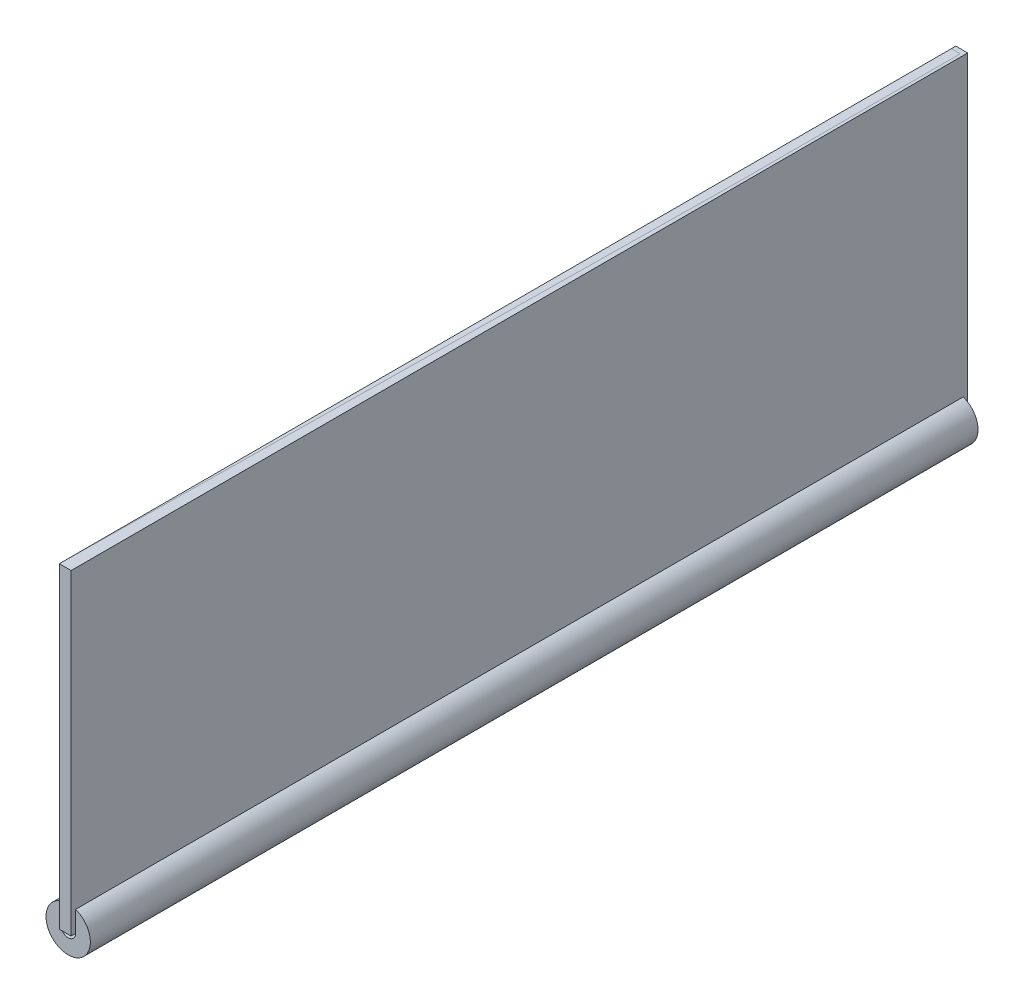
ISO-10303-21;
HEADER;
FILE_DESCRIPTION(('STEP AP214'),'2;1');
FILE_NAME('part.step','',(''),(''),'','','');
FILE_SCHEMA(('AUTOMOTIVE_DESIGN { 1 0 10303 214 1 1 1 1 }'));
ENDSEC;
DATA;
#1=APPLICATION_CONTEXT('core data for automotive mechanical design processes');
#2=APPLICATION_PROTOCOL_DEFINITION('international standard','automotive_design',2000,#1);
#3=PRODUCT_CONTEXT('',#1,'mechanical');
#4=PRODUCT('Part','Part','',(#3));
#5=PRODUCT_RELATED_PRODUCT_CATEGORY('part','',(#4));
#6=PRODUCT_DEFINITION_FORMATION('','',#4);
#7=PRODUCT_DEFINITION_CONTEXT('part definition',#1,'design');
#8=PRODUCT_DEFINITION('design','',#6,#7);
#9=PRODUCT_DEFINITION_SHAPE('','',#8);
#10=(LENGTH_UNIT() NAMED_UNIT(*) SI_UNIT(.MILLI.,.METRE.));
#11=(NAMED_UNIT(*) PLANE_ANGLE_UNIT() SI_UNIT($,.RADIAN.));
#12=(NAMED_UNIT(*) SI_UNIT($,.STERADIAN.) SOLID_ANGLE_UNIT());
#13=UNCERTAINTY_MEASURE_WITH_UNIT(LENGTH_MEASURE(1.E-05),#10,'distance_accuracy_value','');
#14=(GEOMETRIC_REPRESENTATION_CONTEXT(3) GLOBAL_UNCERTAINTY_ASSIGNED_CONTEXT((#13)) GLOBAL_UNIT_ASSIGNED_CONTEXT((#10,
#11,#12)) REPRESENTATION_CONTEXT('',''));
#15=CARTESIAN_POINT('',(0.,0.,0.));
#16=DIRECTION('',(0.,0.,1.));
#17=DIRECTION('',(1.,0.,0.));
#18=AXIS2_PLACEMENT_3D('',#15,#16,#17);
#19=CARTESIAN_POINT('',(4.,53.5,-151.5));
#20=DIRECTION('',(0.,0.,1.));
#21=DIRECTION('',(1.,0.,0.));
#22=AXIS2_PLACEMENT_3D('',#19,#20,#21);
#23=PLANE('',#22);
#24=DIRECTION('',(0.,1.,0.));
#25=VECTOR('',#24,1.);
#26=CARTESIAN_POINT('',(0.,53.5,-151.5));
#27=LINE('',#26,#25);
#28=CARTESIAN_POINT('',(0.,-53.5,-151.5));
#29=VERTEX_POINT('',#28);
#30=CARTESIAN_POINT('',(0.,53.5,-151.5));
#31=VERTEX_POINT('',#30);
#32=EDGE_CURVE('E110',#29,#31,#27,.T.);
#33=ORIENTED_EDGE('',*,*,#32,.T.);
#34=DIRECTION('',(-1.,0.,0.));
#35=VECTOR('',#34,1.);
#36=CARTESIAN_POINT('',(4.,53.5,-151.5));
#37=LINE('',#36,#35);
#38=CARTESIAN_POINT('',(4.,53.5,-151.5));
#39=VERTEX_POINT('',#38);
#40=EDGE_CURVE('E12',#39,#31,#37,.T.);
#41=ORIENTED_EDGE('',*,*,#40,.F.);
#42=DIRECTION('',(0.,1.,0.));
#43=VECTOR('',#42,1.);
#44=CARTESIAN_POINT('',(4.,53.5,-151.5));
#45=LINE('',#44,#43);
#46=CARTESIAN_POINT('',(4.,-53.5,-151.5));
#47=VERTEX_POINT('',#46);
#48=EDGE_CURVE('E98',#47,#39,#45,.T.);
#49=ORIENTED_EDGE('',*,*,#48,.F.);
#50=DIRECTION('',(-1.,0.,0.));
#51=VECTOR('',#50,1.);
#52=CARTESIAN_POINT('',(4.,-53.5,-151.5));
#53=LINE('',#52,#51);
#54=EDGE_CURVE('E106',#47,#29,#53,.T.);
#55=ORIENTED_EDGE('',*,*,#54,.T.);
#56=EDGE_LOOP('',(#33,#41,#49,#55));
#57=FACE_BOUND('',#56,.T.);
#58=ADVANCED_FACE('F47',(#57),#23,.F.);
#59=CARTESIAN_POINT('',(4.,53.5,151.5));
#60=DIRECTION('',(0.,-1.,0.));
#61=DIRECTION('',(0.,0.,-1.));
#62=AXIS2_PLACEMENT_3D('',#59,#60,#61);
#63=PLANE('',#62);
#64=DIRECTION('',(0.,0.,1.));
#65=VECTOR('',#64,1.);
#66=CARTESIAN_POINT('',(0.,53.5,151.5));
#67=LINE('',#66,#65);
#68=CARTESIAN_POINT('',(0.,53.5,151.5));
#69=VERTEX_POINT('',#68);
#70=EDGE_CURVE('E102',#31,#69,#67,.T.);
#71=ORIENTED_EDGE('',*,*,#70,.T.);
#72=DIRECTION('',(-1.,0.,0.));
#73=VECTOR('',#72,1.);
#74=CARTESIAN_POINT('',(4.,53.5,151.5));
#75=LINE('',#74,#73);
#76=CARTESIAN_POINT('',(4.,53.5,151.5));
#77=VERTEX_POINT('',#76);
#78=EDGE_CURVE('E55',#77,#69,#75,.T.);
#79=ORIENTED_EDGE('',*,*,#78,.F.);
#80=DIRECTION('',(0.,0.,1.));
#81=VECTOR('',#80,1.);
#82=CARTESIAN_POINT('',(4.,53.5,151.5));
#83=LINE('',#82,#81);
#84=EDGE_CURVE('E93',#39,#77,#83,.T.);
#85=ORIENTED_EDGE('',*,*,#84,.F.);
#86=ORIENTED_EDGE('',*,*,#40,.T.);
#87=EDGE_LOOP('',(#71,#79,#85,#86));
#88=FACE_BOUND('',#87,.T.);
#89=ADVANCED_FACE('F101',(#88),#63,.F.);
#90=CARTESIAN_POINT('',(4.,53.5,151.5));
#91=DIRECTION('',(0.,0.,-1.));
#92=DIRECTION('',(-1.,0.,0.));
#93=AXIS2_PLACEMENT_3D('',#90,#91,#92);
#94=PLANE('',#93);
#95=DIRECTION('',(0.,-1.,0.));
#96=VECTOR('',#95,1.);
#97=CARTESIAN_POINT('',(0.,53.5,151.5));
#98=LINE('',#97,#96);
#99=CARTESIAN_POINT('',(0.,-53.5,151.5));
#100=VERTEX_POINT('',#99);
#101=EDGE_CURVE('E80',#69,#100,#98,.T.);
#102=ORIENTED_EDGE('',*,*,#101,.T.);
#103=DIRECTION('',(-1.,0.,0.));
#104=VECTOR('',#103,1.);
#105=CARTESIAN_POINT('',(4.,-53.5,151.5));
#106=LINE('',#105,#104);
#107=CARTESIAN_POINT('',(4.,-53.5,151.5));
#108=VERTEX_POINT('',#107);
#109=EDGE_CURVE('E103',#108,#100,#106,.T.);
#110=ORIENTED_EDGE('',*,*,#109,.F.);
#111=DIRECTION('',(0.,-1.,0.));
#112=VECTOR('',#111,1.);
#113=CARTESIAN_POINT('',(4.,53.5,151.5));
#114=LINE('',#113,#112);
#115=EDGE_CURVE('E96',#77,#108,#114,.T.);
#116=ORIENTED_EDGE('',*,*,#115,.F.);
#117=ORIENTED_EDGE('',*,*,#78,.T.);
#118=EDGE_LOOP('',(#102,#110,#116,#117));
#119=FACE_BOUND('',#118,.T.);
#120=ADVANCED_FACE('F104',(#119),#94,.F.);
#121=CARTESIAN_POINT('',(4.,-53.5,151.5));
#122=DIRECTION('',(0.,1.,0.));
#123=DIRECTION('',(0.,0.,1.));
#124=AXIS2_PLACEMENT_3D('',#121,#122,#123);
#125=PLANE('',#124);
#126=DIRECTION('',(0.,0.,-1.));
#127=VECTOR('',#126,1.);
#128=CARTESIAN_POINT('',(0.,-53.5,151.5));
#129=LINE('',#128,#127);
#130=EDGE_CURVE('E86',#100,#29,#129,.T.);
#131=ORIENTED_EDGE('',*,*,#130,.T.);
#132=ORIENTED_EDGE('',*,*,#54,.F.);
#133=DIRECTION('',(0.,0.,-1.));
#134=VECTOR('',#133,1.);
#135=CARTESIAN_POINT('',(4.,-53.5,151.5));
#136=LINE('',#135,#134);
#137=EDGE_CURVE('E63',#108,#47,#136,.T.);
#138=ORIENTED_EDGE('',*,*,#137,.F.);
#139=ORIENTED_EDGE('',*,*,#109,.T.);
#140=EDGE_LOOP('',(#131,#132,#138,#139));
#141=FACE_BOUND('',#140,.T.);
#142=ADVANCED_FACE('F117',(#141),#125,.F.);
#143=CARTESIAN_POINT('',(4.,0.,0.));
#144=DIRECTION('',(1.,0.,0.));
#145=DIRECTION('',(0.,0.,-1.));
#146=AXIS2_PLACEMENT_3D('',#143,#144,#145);
#147=PLANE('',#146);
#148=ORIENTED_EDGE('',*,*,#48,.T.);
#149=ORIENTED_EDGE('',*,*,#84,.T.);
#150=ORIENTED_EDGE('',*,*,#115,.T.);
#151=ORIENTED_EDGE('',*,*,#137,.T.);
#152=EDGE_LOOP('',(#148,#149,#150,#151));
#153=FACE_BOUND('',#152,.T.);
#154=ADVANCED_FACE('F94',(#153),#147,.T.);
#155=CARTESIAN_POINT('',(0.,0.,0.));
#156=DIRECTION('',(1.,0.,0.));
#157=DIRECTION('',(0.,0.,-1.));
#158=AXIS2_PLACEMENT_3D('',#155,#156,#157);
#159=PLANE('',#158);
#160=ORIENTED_EDGE('',*,*,#32,.F.);
#161=ORIENTED_EDGE('',*,*,#130,.F.);
#162=ORIENTED_EDGE('',*,*,#101,.F.);
#163=ORIENTED_EDGE('',*,*,#70,.F.);
#164=EDGE_LOOP('',(#160,#161,#162,#163));
#165=FACE_BOUND('',#164,.T.);
#166=ADVANCED_FACE('F120',(#165),#159,.F.);
#167=CLOSED_SHELL('',(#58,#89,#120,#142,#154,#166));
#168=MANIFOLD_SOLID_BREP('B2',#167);
#169=CARTESIAN_POINT('',(3.,-53.5,150.));
#170=DIRECTION('',(0.,0.,-1.));
#171=DIRECTION('',(-1.,0.,0.));
#172=AXIS2_PLACEMENT_3D('',#169,#170,#171);
#173=PLANE('',#172);
#174=CARTESIAN_POINT('',(1.5,-53.5,150.));
#175=DIRECTION('',(0.,0.,1.));
#176=DIRECTION('',(1.,0.,0.));
#177=AXIS2_PLACEMENT_3D('',#174,#175,#176);
#178=CIRCLE('',#177,2.5);
#179=CARTESIAN_POINT('',(4.,-53.5,150.));
#180=VERTEX_POINT('',#179);
#181=EDGE_CURVE('E264',#180,#180,#178,.T.);
#182=ORIENTED_EDGE('',*,*,#181,.F.);
#183=EDGE_LOOP('',(#182));
#184=FACE_BOUND('',#183,.T.);
#185=DIRECTION('',(0.,-1.,0.));
#186=VECTOR('',#185,1.);
#187=CARTESIAN_POINT('',(0.,-53.5,150.));
#188=LINE('',#187,#186);
#189=CARTESIAN_POINT('',(0.,53.5,150.));
#190=VERTEX_POINT('',#189);
#191=CARTESIAN_POINT('',(0.,-46.1515307716505,150.));
#192=VERTEX_POINT('',#191);
#193=EDGE_CURVE('E219',#190,#192,#188,.T.);
#194=ORIENTED_EDGE('',*,*,#193,.T.);
#195=CARTESIAN_POINT('',(1.5,-53.5,150.));
#196=DIRECTION('',(0.,0.,1.));
#197=DIRECTION('',(1.,0.,0.));
#198=AXIS2_PLACEMENT_3D('',#195,#196,#197);
#199=CIRCLE('',#198,7.5);
#200=CARTESIAN_POINT('',(3.,-46.1515307716505,150.));
#201=VERTEX_POINT('',#200);
#202=EDGE_CURVE('E216',#192,#201,#199,.T.);
#203=ORIENTED_EDGE('',*,*,#202,.T.);
#204=DIRECTION('',(0.,-1.,0.));
#205=VECTOR('',#204,1.);
#206=CARTESIAN_POINT('',(3.,-53.5,150.));
#207=LINE('',#206,#205);
#208=CARTESIAN_POINT('',(3.,53.5,150.));
#209=VERTEX_POINT('',#208);
#210=EDGE_CURVE('E225',#209,#201,#207,.T.);
#211=ORIENTED_EDGE('',*,*,#210,.F.);
#212=DIRECTION('',(-1.,0.,0.));
#213=VECTOR('',#212,1.);
#214=CARTESIAN_POINT('',(3.,53.5,150.));
#215=LINE('',#214,#213);
#216=EDGE_CURVE('E237',#209,#190,#215,.T.);
#217=ORIENTED_EDGE('',*,*,#216,.T.);
#218=EDGE_LOOP('',(#194,#203,#211,#217));
#219=FACE_BOUND('',#218,.T.);
#220=ADVANCED_FACE('F171',(#184,#219),#173,.F.);
#221=CARTESIAN_POINT('',(3.,-53.5,-150.));
#222=DIRECTION('',(0.,0.,1.));
#223=DIRECTION('',(1.,0.,0.));
#224=AXIS2_PLACEMENT_3D('',#221,#222,#223);
#225=PLANE('',#224);
#226=CARTESIAN_POINT('',(1.5,-53.5,-150.));
#227=DIRECTION('',(0.,0.,1.));
#228=DIRECTION('',(1.,0.,0.));
#229=AXIS2_PLACEMENT_3D('',#226,#227,#228);
#230=CIRCLE('',#229,2.5);
#231=CARTESIAN_POINT('',(4.,-53.5,-150.));
#232=VERTEX_POINT('',#231);
#233=EDGE_CURVE('E227',#232,#232,#230,.T.);
#234=ORIENTED_EDGE('',*,*,#233,.T.);
#235=EDGE_LOOP('',(#234));
#236=FACE_BOUND('',#235,.T.);
#237=DIRECTION('',(0.,1.,0.));
#238=VECTOR('',#237,1.);
#239=CARTESIAN_POINT('',(3.,-53.5,-150.));
#240=LINE('',#239,#238);
#241=CARTESIAN_POINT('',(3.,-46.1515307716504,-150.));
#242=VERTEX_POINT('',#241);
#243=CARTESIAN_POINT('',(3.,53.5,-150.));
#244=VERTEX_POINT('',#243);
#245=EDGE_CURVE('E230',#242,#244,#240,.T.);
#246=ORIENTED_EDGE('',*,*,#245,.F.);
#247=CARTESIAN_POINT('',(1.5,-53.5,-150.));
#248=DIRECTION('',(0.,0.,1.));
#249=DIRECTION('',(1.,0.,0.));
#250=AXIS2_PLACEMENT_3D('',#247,#248,#249);
#251=CIRCLE('',#250,7.5);
#252=CARTESIAN_POINT('',(0.,-46.1515307716504,-150.));
#253=VERTEX_POINT('',#252);
#254=EDGE_CURVE('E217',#253,#242,#251,.T.);
#255=ORIENTED_EDGE('',*,*,#254,.F.);
#256=DIRECTION('',(0.,1.,0.));
#257=VECTOR('',#256,1.);
#258=CARTESIAN_POINT('',(0.,-53.5,-150.));
#259=LINE('',#258,#257);
#260=CARTESIAN_POINT('',(0.,53.5,-150.));
#261=VERTEX_POINT('',#260);
#262=EDGE_CURVE('E198',#253,#261,#259,.T.);
#263=ORIENTED_EDGE('',*,*,#262,.T.);
#264=DIRECTION('',(-1.,0.,0.));
#265=VECTOR('',#264,1.);
#266=CARTESIAN_POINT('',(3.,53.5,-150.));
#267=LINE('',#266,#265);
#268=EDGE_CURVE('E179',#244,#261,#267,.T.);
#269=ORIENTED_EDGE('',*,*,#268,.F.);
#270=EDGE_LOOP('',(#246,#255,#263,#269));
#271=FACE_BOUND('',#270,.T.);
#272=ADVANCED_FACE('F256',(#236,#271),#225,.F.);
#273=CARTESIAN_POINT('',(3.,53.5,-150.));
#274=DIRECTION('',(0.,-1.,0.));
#275=DIRECTION('',(0.,0.,-1.));
#276=AXIS2_PLACEMENT_3D('',#273,#274,#275);
#277=PLANE('',#276);
#278=DIRECTION('',(0.,0.,1.));
#279=VECTOR('',#278,1.);
#280=CARTESIAN_POINT('',(0.,53.5,-150.));
#281=LINE('',#280,#279);
#282=EDGE_CURVE('E231',#261,#190,#281,.T.);
#283=ORIENTED_EDGE('',*,*,#282,.T.);
#284=ORIENTED_EDGE('',*,*,#216,.F.);
#285=DIRECTION('',(0.,0.,1.));
#286=VECTOR('',#285,1.);
#287=CARTESIAN_POINT('',(3.,53.5,-150.));
#288=LINE('',#287,#286);
#289=EDGE_CURVE('E187',#244,#209,#288,.T.);
#290=ORIENTED_EDGE('',*,*,#289,.F.);
#291=ORIENTED_EDGE('',*,*,#268,.T.);
#292=EDGE_LOOP('',(#283,#284,#290,#291));
#293=FACE_BOUND('',#292,.T.);
#294=ADVANCED_FACE('F242',(#293),#277,.F.);
#295=CARTESIAN_POINT('',(3.,0.,0.));
#296=DIRECTION('',(1.,0.,0.));
#297=DIRECTION('',(0.,0.,-1.));
#298=AXIS2_PLACEMENT_3D('',#295,#296,#297);
#299=PLANE('',#298);
#300=DIRECTION('',(0.,0.,1.));
#301=VECTOR('',#300,1.);
#302=CARTESIAN_POINT('',(3.,-46.1515307716504,-150.));
#303=LINE('',#302,#301);
#304=EDGE_CURVE('E213',#242,#201,#303,.T.);
#305=ORIENTED_EDGE('',*,*,#304,.F.);
#306=ORIENTED_EDGE('',*,*,#245,.T.);
#307=ORIENTED_EDGE('',*,*,#289,.T.);
#308=ORIENTED_EDGE('',*,*,#210,.T.);
#309=EDGE_LOOP('',(#305,#306,#307,#308));
#310=FACE_BOUND('',#309,.T.);
#311=ADVANCED_FACE('F229',(#310),#299,.T.);
#312=CARTESIAN_POINT('',(0.,0.,0.));
#313=DIRECTION('',(1.,0.,0.));
#314=DIRECTION('',(0.,0.,-1.));
#315=AXIS2_PLACEMENT_3D('',#312,#313,#314);
#316=PLANE('',#315);
#317=ORIENTED_EDGE('',*,*,#262,.F.);
#318=DIRECTION('',(0.,0.,1.));
#319=VECTOR('',#318,1.);
#320=CARTESIAN_POINT('',(0.,-46.1515307716504,-150.));
#321=LINE('',#320,#319);
#322=EDGE_CURVE('E45',#253,#192,#321,.T.);
#323=ORIENTED_EDGE('',*,*,#322,.T.);
#324=ORIENTED_EDGE('',*,*,#193,.F.);
#325=ORIENTED_EDGE('',*,*,#282,.F.);
#326=EDGE_LOOP('',(#317,#323,#324,#325));
#327=FACE_BOUND('',#326,.T.);
#328=ADVANCED_FACE('F244',(#327),#316,.F.);
#329=CARTESIAN_POINT('',(1.5,-53.5,-150.));
#330=DIRECTION('',(0.,0.,1.));
#331=DIRECTION('',(0.,-1.,0.));
#332=AXIS2_PLACEMENT_3D('',#329,#330,#331);
#333=CYLINDRICAL_SURFACE('',#332,7.5);
#334=ORIENTED_EDGE('',*,*,#254,.T.);
#335=ORIENTED_EDGE('',*,*,#304,.T.);
#336=ORIENTED_EDGE('',*,*,#202,.F.);
#337=ORIENTED_EDGE('',*,*,#322,.F.);
#338=EDGE_LOOP('',(#334,#335,#336,#337));
#339=FACE_BOUND('',#338,.T.);
#340=ADVANCED_FACE('F215',(#339),#333,.T.);
#341=CARTESIAN_POINT('',(1.5,-53.5,-150.));
#342=DIRECTION('',(0.,0.,1.));
#343=DIRECTION('',(1.,0.,0.));
#344=AXIS2_PLACEMENT_3D('',#341,#342,#343);
#345=CYLINDRICAL_SURFACE('',#344,2.5);
#346=ORIENTED_EDGE('',*,*,#233,.F.);
#347=EDGE_LOOP('',(#346));
#348=FACE_BOUND('',#347,.T.);
#349=ORIENTED_EDGE('',*,*,#181,.T.);
#350=EDGE_LOOP('',(#349));
#351=FACE_BOUND('',#350,.T.);
#352=ADVANCED_FACE('F251',(#348,#351),#345,.F.);
#353=CLOSED_SHELL('',(#220,#272,#294,#311,#328,#340,#352));
#354=MANIFOLD_SOLID_BREP('B6',#353);
#355=ADVANCED_BREP_SHAPE_REPRESENTATION('',(#18,#168,#354),#14);
#356=SHAPE_DEFINITION_REPRESENTATION(#9,#355);
ENDSEC;
END-ISO-10303-21;
